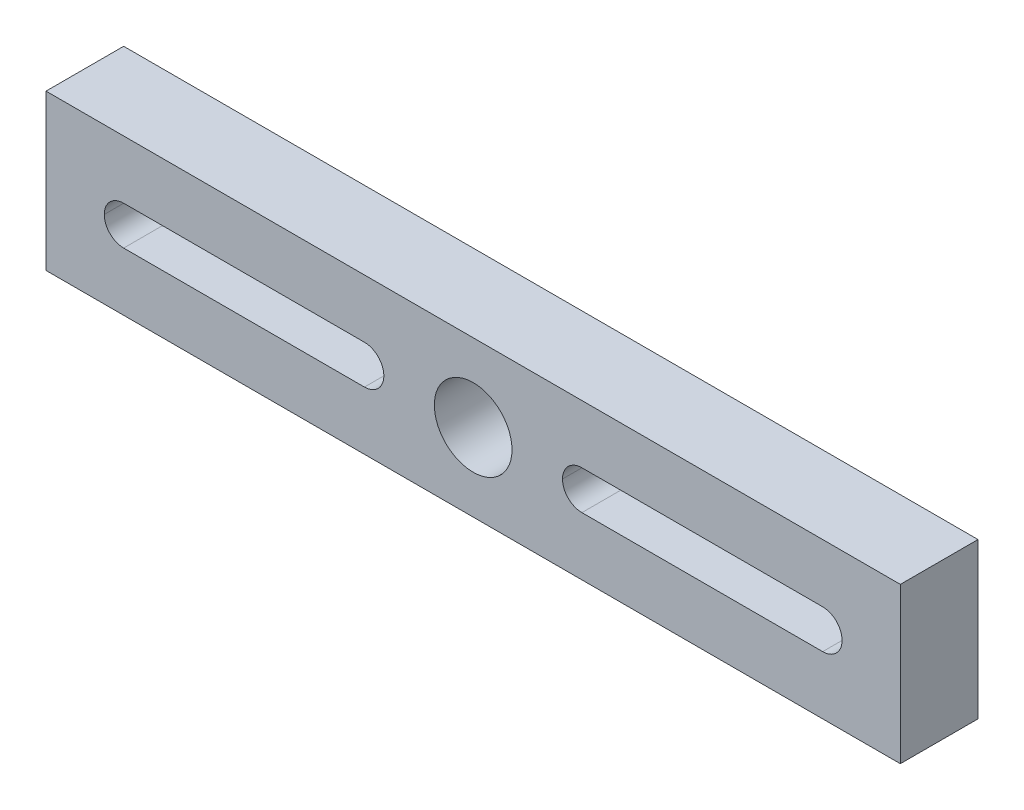
ISO-10303-21;
HEADER;
FILE_DESCRIPTION(('STEP AP214'),'2;1');
FILE_NAME('part.step','',(''),(''),'','','');
FILE_SCHEMA(('AUTOMOTIVE_DESIGN { 1 0 10303 214 1 1 1 1 }'));
ENDSEC;
DATA;
#1=APPLICATION_CONTEXT('core data for automotive mechanical design processes');
#2=APPLICATION_PROTOCOL_DEFINITION('international standard','automotive_design',2000,#1);
#3=PRODUCT_CONTEXT('',#1,'mechanical');
#4=PRODUCT('Part','Part','',(#3));
#5=PRODUCT_RELATED_PRODUCT_CATEGORY('part','',(#4));
#6=PRODUCT_DEFINITION_FORMATION('','',#4);
#7=PRODUCT_DEFINITION_CONTEXT('part definition',#1,'design');
#8=PRODUCT_DEFINITION('design','',#6,#7);
#9=PRODUCT_DEFINITION_SHAPE('','',#8);
#10=(LENGTH_UNIT() NAMED_UNIT(*) SI_UNIT(.MILLI.,.METRE.));
#11=(NAMED_UNIT(*) PLANE_ANGLE_UNIT() SI_UNIT($,.RADIAN.));
#12=(NAMED_UNIT(*) SI_UNIT($,.STERADIAN.) SOLID_ANGLE_UNIT());
#13=UNCERTAINTY_MEASURE_WITH_UNIT(LENGTH_MEASURE(1.E-05),#10,'distance_accuracy_value','');
#14=(GEOMETRIC_REPRESENTATION_CONTEXT(3) GLOBAL_UNCERTAINTY_ASSIGNED_CONTEXT((#13)) GLOBAL_UNIT_ASSIGNED_CONTEXT((#10,
#11,#12)) REPRESENTATION_CONTEXT('',''));
#15=CARTESIAN_POINT('',(0.,0.,0.));
#16=DIRECTION('',(0.,0.,1.));
#17=DIRECTION('',(1.,0.,0.));
#18=AXIS2_PLACEMENT_3D('',#15,#16,#17);
#19=CARTESIAN_POINT('',(0.,0.,12.7));
#20=DIRECTION('',(0.,0.,1.));
#21=DIRECTION('',(1.,0.,0.));
#22=AXIS2_PLACEMENT_3D('',#19,#20,#21);
#23=PLANE('',#22);
#24=CARTESIAN_POINT('',(-57.15,0.,12.7));
#25=DIRECTION('',(0.,0.,1.));
#26=DIRECTION('',(1.,0.,0.));
#27=AXIS2_PLACEMENT_3D('',#24,#25,#26);
#28=CIRCLE('',#27,3.175);
#29=CARTESIAN_POINT('',(-57.15,-3.175,12.7));
#30=VERTEX_POINT('',#29);
#31=CARTESIAN_POINT('',(-60.325,0.,12.7));
#32=VERTEX_POINT('',#31);
#33=EDGE_CURVE('E243',#30,#32,#28,.F.);
#34=ORIENTED_EDGE('',*,*,#33,.T.);
#35=CARTESIAN_POINT('',(-57.15,0.,12.7));
#36=DIRECTION('',(0.,0.,1.));
#37=DIRECTION('',(1.,0.,0.));
#38=AXIS2_PLACEMENT_3D('',#35,#36,#37);
#39=CIRCLE('',#38,3.175);
#40=CARTESIAN_POINT('',(-57.15,3.175,12.7));
#41=VERTEX_POINT('',#40);
#42=EDGE_CURVE('E249',#32,#41,#39,.F.);
#43=ORIENTED_EDGE('',*,*,#42,.T.);
#44=DIRECTION('',(-1.,0.,0.));
#45=VECTOR('',#44,1.);
#46=CARTESIAN_POINT('',(-60.325,3.175,12.7));
#47=LINE('',#46,#45);
#48=CARTESIAN_POINT('',(-17.78,3.175,12.7));
#49=VERTEX_POINT('',#48);
#50=EDGE_CURVE('E321',#49,#41,#47,.T.);
#51=ORIENTED_EDGE('',*,*,#50,.F.);
#52=CARTESIAN_POINT('',(-17.78,0.,12.7));
#53=DIRECTION('',(0.,0.,1.));
#54=DIRECTION('',(1.,0.,0.));
#55=AXIS2_PLACEMENT_3D('',#52,#53,#54);
#56=CIRCLE('',#55,3.175);
#57=CARTESIAN_POINT('',(-14.605,0.,12.7));
#58=VERTEX_POINT('',#57);
#59=EDGE_CURVE('E231',#49,#58,#56,.F.);
#60=ORIENTED_EDGE('',*,*,#59,.T.);
#61=CARTESIAN_POINT('',(-17.78,0.,12.7));
#62=DIRECTION('',(0.,0.,1.));
#63=DIRECTION('',(1.,0.,0.));
#64=AXIS2_PLACEMENT_3D('',#61,#62,#63);
#65=CIRCLE('',#64,3.175);
#66=CARTESIAN_POINT('',(-17.78,-3.175,12.7));
#67=VERTEX_POINT('',#66);
#68=EDGE_CURVE('E237',#58,#67,#65,.F.);
#69=ORIENTED_EDGE('',*,*,#68,.T.);
#70=DIRECTION('',(1.,0.,0.));
#71=VECTOR('',#70,1.);
#72=CARTESIAN_POINT('',(-60.325,-3.175,12.7));
#73=LINE('',#72,#71);
#74=EDGE_CURVE('E316',#30,#67,#73,.T.);
#75=ORIENTED_EDGE('',*,*,#74,.F.);
#76=EDGE_LOOP('',(#34,#43,#51,#60,#69,#75));
#77=FACE_BOUND('',#76,.T.);
#78=DIRECTION('',(-1.,0.,0.));
#79=VECTOR('',#78,1.);
#80=CARTESIAN_POINT('',(60.325,3.175,12.7));
#81=LINE('',#80,#79);
#82=CARTESIAN_POINT('',(57.15,3.175,12.7));
#83=VERTEX_POINT('',#82);
#84=CARTESIAN_POINT('',(17.78,3.175,12.7));
#85=VERTEX_POINT('',#84);
#86=EDGE_CURVE('E278',#83,#85,#81,.T.);
#87=ORIENTED_EDGE('',*,*,#86,.F.);
#88=CARTESIAN_POINT('',(57.15,0.,12.7));
#89=DIRECTION('',(0.,0.,1.));
#90=DIRECTION('',(1.,0.,0.));
#91=AXIS2_PLACEMENT_3D('',#88,#89,#90);
#92=CIRCLE('',#91,3.175);
#93=CARTESIAN_POINT('',(60.325,0.,12.7));
#94=VERTEX_POINT('',#93);
#95=EDGE_CURVE('E49',#83,#94,#92,.F.);
#96=ORIENTED_EDGE('',*,*,#95,.T.);
#97=CARTESIAN_POINT('',(57.15,0.,12.7));
#98=DIRECTION('',(0.,0.,1.));
#99=DIRECTION('',(1.,0.,0.));
#100=AXIS2_PLACEMENT_3D('',#97,#98,#99);
#101=CIRCLE('',#100,3.175);
#102=CARTESIAN_POINT('',(57.15,-3.175,12.7));
#103=VERTEX_POINT('',#102);
#104=EDGE_CURVE('E267',#94,#103,#101,.F.);
#105=ORIENTED_EDGE('',*,*,#104,.T.);
#106=DIRECTION('',(1.,0.,0.));
#107=VECTOR('',#106,1.);
#108=CARTESIAN_POINT('',(60.325,-3.175,12.7));
#109=LINE('',#108,#107);
#110=CARTESIAN_POINT('',(17.78,-3.175,12.7));
#111=VERTEX_POINT('',#110);
#112=EDGE_CURVE('E314',#111,#103,#109,.T.);
#113=ORIENTED_EDGE('',*,*,#112,.F.);
#114=CARTESIAN_POINT('',(17.78,0.,12.7));
#115=DIRECTION('',(0.,0.,1.));
#116=DIRECTION('',(1.,0.,0.));
#117=AXIS2_PLACEMENT_3D('',#114,#115,#116);
#118=CIRCLE('',#117,3.175);
#119=CARTESIAN_POINT('',(14.605,0.,12.7));
#120=VERTEX_POINT('',#119);
#121=EDGE_CURVE('E261',#111,#120,#118,.F.);
#122=ORIENTED_EDGE('',*,*,#121,.T.);
#123=CARTESIAN_POINT('',(17.78,0.,12.7));
#124=DIRECTION('',(0.,0.,1.));
#125=DIRECTION('',(1.,0.,0.));
#126=AXIS2_PLACEMENT_3D('',#123,#124,#125);
#127=CIRCLE('',#126,3.175);
#128=EDGE_CURVE('E255',#120,#85,#127,.F.);
#129=ORIENTED_EDGE('',*,*,#128,.T.);
#130=EDGE_LOOP('',(#87,#96,#105,#113,#122,#129));
#131=FACE_BOUND('',#130,.T.);
#132=DIRECTION('',(0.,-1.,0.));
#133=VECTOR('',#132,1.);
#134=CARTESIAN_POINT('',(-69.85,12.7,12.7));
#135=LINE('',#134,#133);
#136=CARTESIAN_POINT('',(-69.85,12.7,12.7));
#137=VERTEX_POINT('',#136);
#138=CARTESIAN_POINT('',(-69.85,-12.7,12.7));
#139=VERTEX_POINT('',#138);
#140=EDGE_CURVE('E166',#137,#139,#135,.T.);
#141=ORIENTED_EDGE('',*,*,#140,.T.);
#142=DIRECTION('',(1.,0.,0.));
#143=VECTOR('',#142,1.);
#144=CARTESIAN_POINT('',(-69.85,-12.7,12.7));
#145=LINE('',#144,#143);
#146=CARTESIAN_POINT('',(69.85,-12.7,12.7));
#147=VERTEX_POINT('',#146);
#148=EDGE_CURVE('E154',#139,#147,#145,.T.);
#149=ORIENTED_EDGE('',*,*,#148,.T.);
#150=DIRECTION('',(0.,1.,0.));
#151=VECTOR('',#150,1.);
#152=CARTESIAN_POINT('',(69.85,12.7,12.7));
#153=LINE('',#152,#151);
#154=CARTESIAN_POINT('',(69.85,12.7,12.7));
#155=VERTEX_POINT('',#154);
#156=EDGE_CURVE('E165',#147,#155,#153,.T.);
#157=ORIENTED_EDGE('',*,*,#156,.T.);
#158=DIRECTION('',(-1.,0.,0.));
#159=VECTOR('',#158,1.);
#160=CARTESIAN_POINT('',(-69.85,12.7,12.7));
#161=LINE('',#160,#159);
#162=EDGE_CURVE('E171',#155,#137,#161,.T.);
#163=ORIENTED_EDGE('',*,*,#162,.T.);
#164=EDGE_LOOP('',(#141,#149,#157,#163));
#165=FACE_BOUND('',#164,.T.);
#166=CARTESIAN_POINT('',(0.,0.,12.7));
#167=DIRECTION('',(0.,0.,1.));
#168=DIRECTION('',(1.,0.,0.));
#169=AXIS2_PLACEMENT_3D('',#166,#167,#168);
#170=CIRCLE('',#169,6.35);
#171=CARTESIAN_POINT('',(6.35,0.,12.7));
#172=VERTEX_POINT('',#171);
#173=EDGE_CURVE('E326',#172,#172,#170,.T.);
#174=ORIENTED_EDGE('',*,*,#173,.F.);
#175=EDGE_LOOP('',(#174));
#176=FACE_BOUND('',#175,.T.);
#177=ADVANCED_FACE('F39',(#77,#131,#165,#176),#23,.T.);
#178=CARTESIAN_POINT('',(0.,0.,0.));
#179=DIRECTION('',(0.,0.,1.));
#180=DIRECTION('',(1.,0.,0.));
#181=AXIS2_PLACEMENT_3D('',#178,#179,#180);
#182=PLANE('',#181);
#183=DIRECTION('',(1.,0.,0.));
#184=VECTOR('',#183,1.);
#185=CARTESIAN_POINT('',(0.,-3.175,0.));
#186=LINE('',#185,#184);
#187=CARTESIAN_POINT('',(-57.15,-3.175,0.));
#188=VERTEX_POINT('',#187);
#189=CARTESIAN_POINT('',(-17.78,-3.175,0.));
#190=VERTEX_POINT('',#189);
#191=EDGE_CURVE('E195',#188,#190,#186,.T.);
#192=ORIENTED_EDGE('',*,*,#191,.T.);
#193=CARTESIAN_POINT('',(-17.78,0.,0.));
#194=DIRECTION('',(0.,0.,1.));
#195=DIRECTION('',(1.,0.,0.));
#196=AXIS2_PLACEMENT_3D('',#193,#194,#195);
#197=CIRCLE('',#196,3.175);
#198=CARTESIAN_POINT('',(-14.605,0.,0.));
#199=VERTEX_POINT('',#198);
#200=EDGE_CURVE('E240',#190,#199,#197,.T.);
#201=ORIENTED_EDGE('',*,*,#200,.T.);
#202=CARTESIAN_POINT('',(-17.78,0.,0.));
#203=DIRECTION('',(0.,0.,1.));
#204=DIRECTION('',(1.,0.,0.));
#205=AXIS2_PLACEMENT_3D('',#202,#203,#204);
#206=CIRCLE('',#205,3.175);
#207=CARTESIAN_POINT('',(-17.78,3.175,0.));
#208=VERTEX_POINT('',#207);
#209=EDGE_CURVE('E234',#199,#208,#206,.T.);
#210=ORIENTED_EDGE('',*,*,#209,.T.);
#211=DIRECTION('',(-1.,0.,0.));
#212=VECTOR('',#211,1.);
#213=CARTESIAN_POINT('',(0.,3.175,0.));
#214=LINE('',#213,#212);
#215=CARTESIAN_POINT('',(-57.15,3.175,0.));
#216=VERTEX_POINT('',#215);
#217=EDGE_CURVE('E199',#208,#216,#214,.T.);
#218=ORIENTED_EDGE('',*,*,#217,.T.);
#219=CARTESIAN_POINT('',(-57.15,0.,0.));
#220=DIRECTION('',(0.,0.,1.));
#221=DIRECTION('',(1.,0.,0.));
#222=AXIS2_PLACEMENT_3D('',#219,#220,#221);
#223=CIRCLE('',#222,3.175);
#224=CARTESIAN_POINT('',(-60.325,0.,0.));
#225=VERTEX_POINT('',#224);
#226=EDGE_CURVE('E252',#216,#225,#223,.T.);
#227=ORIENTED_EDGE('',*,*,#226,.T.);
#228=CARTESIAN_POINT('',(-57.15,0.,0.));
#229=DIRECTION('',(0.,0.,1.));
#230=DIRECTION('',(1.,0.,0.));
#231=AXIS2_PLACEMENT_3D('',#228,#229,#230);
#232=CIRCLE('',#231,3.175);
#233=EDGE_CURVE('E246',#225,#188,#232,.T.);
#234=ORIENTED_EDGE('',*,*,#233,.T.);
#235=EDGE_LOOP('',(#192,#201,#210,#218,#227,#234));
#236=FACE_BOUND('',#235,.T.);
#237=CARTESIAN_POINT('',(57.15,0.,0.));
#238=DIRECTION('',(0.,0.,1.));
#239=DIRECTION('',(1.,0.,0.));
#240=AXIS2_PLACEMENT_3D('',#237,#238,#239);
#241=CIRCLE('',#240,3.175);
#242=CARTESIAN_POINT('',(57.15,-3.175,0.));
#243=VERTEX_POINT('',#242);
#244=CARTESIAN_POINT('',(60.325,0.,0.));
#245=VERTEX_POINT('',#244);
#246=EDGE_CURVE('E56',#243,#245,#241,.T.);
#247=ORIENTED_EDGE('',*,*,#246,.T.);
#248=CARTESIAN_POINT('',(57.15,0.,0.));
#249=DIRECTION('',(0.,0.,1.));
#250=DIRECTION('',(1.,0.,0.));
#251=AXIS2_PLACEMENT_3D('',#248,#249,#250);
#252=CIRCLE('',#251,3.175);
#253=CARTESIAN_POINT('',(57.15,3.175,0.));
#254=VERTEX_POINT('',#253);
#255=EDGE_CURVE('E11',#245,#254,#252,.T.);
#256=ORIENTED_EDGE('',*,*,#255,.T.);
#257=DIRECTION('',(-1.,0.,0.));
#258=VECTOR('',#257,1.);
#259=CARTESIAN_POINT('',(0.,3.175,0.));
#260=LINE('',#259,#258);
#261=CARTESIAN_POINT('',(17.78,3.175,0.));
#262=VERTEX_POINT('',#261);
#263=EDGE_CURVE('E186',#254,#262,#260,.T.);
#264=ORIENTED_EDGE('',*,*,#263,.T.);
#265=CARTESIAN_POINT('',(17.78,0.,0.));
#266=DIRECTION('',(0.,0.,1.));
#267=DIRECTION('',(1.,0.,0.));
#268=AXIS2_PLACEMENT_3D('',#265,#266,#267);
#269=CIRCLE('',#268,3.175);
#270=CARTESIAN_POINT('',(14.605,0.,0.));
#271=VERTEX_POINT('',#270);
#272=EDGE_CURVE('E258',#262,#271,#269,.T.);
#273=ORIENTED_EDGE('',*,*,#272,.T.);
#274=CARTESIAN_POINT('',(17.78,0.,0.));
#275=DIRECTION('',(0.,0.,1.));
#276=DIRECTION('',(1.,0.,0.));
#277=AXIS2_PLACEMENT_3D('',#274,#275,#276);
#278=CIRCLE('',#277,3.175);
#279=CARTESIAN_POINT('',(17.78,-3.175,0.));
#280=VERTEX_POINT('',#279);
#281=EDGE_CURVE('E264',#271,#280,#278,.T.);
#282=ORIENTED_EDGE('',*,*,#281,.T.);
#283=DIRECTION('',(1.,0.,0.));
#284=VECTOR('',#283,1.);
#285=CARTESIAN_POINT('',(0.,-3.175,0.));
#286=LINE('',#285,#284);
#287=EDGE_CURVE('E182',#280,#243,#286,.T.);
#288=ORIENTED_EDGE('',*,*,#287,.T.);
#289=EDGE_LOOP('',(#247,#256,#264,#273,#282,#288));
#290=FACE_BOUND('',#289,.T.);
#291=DIRECTION('',(0.,-1.,0.));
#292=VECTOR('',#291,1.);
#293=CARTESIAN_POINT('',(-69.85,12.7,0.));
#294=LINE('',#293,#292);
#295=CARTESIAN_POINT('',(-69.85,12.7,0.));
#296=VERTEX_POINT('',#295);
#297=CARTESIAN_POINT('',(-69.85,-12.7,0.));
#298=VERTEX_POINT('',#297);
#299=EDGE_CURVE('E180',#296,#298,#294,.T.);
#300=ORIENTED_EDGE('',*,*,#299,.F.);
#301=DIRECTION('',(-1.,0.,0.));
#302=VECTOR('',#301,1.);
#303=CARTESIAN_POINT('',(-69.85,12.7,0.));
#304=LINE('',#303,#302);
#305=CARTESIAN_POINT('',(69.85,12.7,0.));
#306=VERTEX_POINT('',#305);
#307=EDGE_CURVE('E176',#306,#296,#304,.T.);
#308=ORIENTED_EDGE('',*,*,#307,.F.);
#309=DIRECTION('',(0.,1.,0.));
#310=VECTOR('',#309,1.);
#311=CARTESIAN_POINT('',(69.85,12.7,0.));
#312=LINE('',#311,#310);
#313=CARTESIAN_POINT('',(69.85,-12.7,0.));
#314=VERTEX_POINT('',#313);
#315=EDGE_CURVE('E344',#314,#306,#312,.T.);
#316=ORIENTED_EDGE('',*,*,#315,.F.);
#317=DIRECTION('',(1.,0.,0.));
#318=VECTOR('',#317,1.);
#319=CARTESIAN_POINT('',(-69.85,-12.7,0.));
#320=LINE('',#319,#318);
#321=EDGE_CURVE('E341',#298,#314,#320,.T.);
#322=ORIENTED_EDGE('',*,*,#321,.F.);
#323=EDGE_LOOP('',(#300,#308,#316,#322));
#324=FACE_BOUND('',#323,.T.);
#325=CARTESIAN_POINT('',(0.,0.,0.));
#326=DIRECTION('',(0.,0.,1.));
#327=DIRECTION('',(1.,0.,0.));
#328=AXIS2_PLACEMENT_3D('',#325,#326,#327);
#329=CIRCLE('',#328,6.35);
#330=CARTESIAN_POINT('',(6.35,0.,0.));
#331=VERTEX_POINT('',#330);
#332=EDGE_CURVE('E330',#331,#331,#329,.T.);
#333=ORIENTED_EDGE('',*,*,#332,.T.);
#334=EDGE_LOOP('',(#333));
#335=FACE_BOUND('',#334,.T.);
#336=ADVANCED_FACE('F297',(#236,#290,#324,#335),#182,.F.);
#337=CARTESIAN_POINT('',(-69.85,12.7,12.7));
#338=DIRECTION('',(1.,0.,0.));
#339=DIRECTION('',(0.,0.,-1.));
#340=AXIS2_PLACEMENT_3D('',#337,#338,#339);
#341=PLANE('',#340);
#342=ORIENTED_EDGE('',*,*,#299,.T.);
#343=DIRECTION('',(0.,0.,-1.));
#344=VECTOR('',#343,1.);
#345=CARTESIAN_POINT('',(-69.85,-12.7,12.7));
#346=LINE('',#345,#344);
#347=EDGE_CURVE('E158',#139,#298,#346,.T.);
#348=ORIENTED_EDGE('',*,*,#347,.F.);
#349=ORIENTED_EDGE('',*,*,#140,.F.);
#350=DIRECTION('',(0.,0.,-1.));
#351=VECTOR('',#350,1.);
#352=CARTESIAN_POINT('',(-69.85,12.7,12.7));
#353=LINE('',#352,#351);
#354=EDGE_CURVE('E338',#137,#296,#353,.T.);
#355=ORIENTED_EDGE('',*,*,#354,.T.);
#356=EDGE_LOOP('',(#342,#348,#349,#355));
#357=FACE_BOUND('',#356,.T.);
#358=ADVANCED_FACE('F178',(#357),#341,.F.);
#359=CARTESIAN_POINT('',(-69.85,-12.7,12.7));
#360=DIRECTION('',(0.,1.,0.));
#361=DIRECTION('',(0.,0.,1.));
#362=AXIS2_PLACEMENT_3D('',#359,#360,#361);
#363=PLANE('',#362);
#364=ORIENTED_EDGE('',*,*,#321,.T.);
#365=DIRECTION('',(0.,0.,-1.));
#366=VECTOR('',#365,1.);
#367=CARTESIAN_POINT('',(69.85,-12.7,12.7));
#368=LINE('',#367,#366);
#369=EDGE_CURVE('E161',#147,#314,#368,.T.);
#370=ORIENTED_EDGE('',*,*,#369,.F.);
#371=ORIENTED_EDGE('',*,*,#148,.F.);
#372=ORIENTED_EDGE('',*,*,#347,.T.);
#373=EDGE_LOOP('',(#364,#370,#371,#372));
#374=FACE_BOUND('',#373,.T.);
#375=ADVANCED_FACE('F156',(#374),#363,.F.);
#376=CARTESIAN_POINT('',(69.85,12.7,12.7));
#377=DIRECTION('',(-1.,0.,0.));
#378=DIRECTION('',(0.,0.,1.));
#379=AXIS2_PLACEMENT_3D('',#376,#377,#378);
#380=PLANE('',#379);
#381=ORIENTED_EDGE('',*,*,#315,.T.);
#382=DIRECTION('',(0.,0.,-1.));
#383=VECTOR('',#382,1.);
#384=CARTESIAN_POINT('',(69.85,12.7,12.7));
#385=LINE('',#384,#383);
#386=EDGE_CURVE('E188',#155,#306,#385,.T.);
#387=ORIENTED_EDGE('',*,*,#386,.F.);
#388=ORIENTED_EDGE('',*,*,#156,.F.);
#389=ORIENTED_EDGE('',*,*,#369,.T.);
#390=EDGE_LOOP('',(#381,#387,#388,#389));
#391=FACE_BOUND('',#390,.T.);
#392=ADVANCED_FACE('F359',(#391),#380,.F.);
#393=CARTESIAN_POINT('',(-69.85,12.7,12.7));
#394=DIRECTION('',(0.,-1.,0.));
#395=DIRECTION('',(0.,0.,-1.));
#396=AXIS2_PLACEMENT_3D('',#393,#394,#395);
#397=PLANE('',#396);
#398=ORIENTED_EDGE('',*,*,#307,.T.);
#399=ORIENTED_EDGE('',*,*,#354,.F.);
#400=ORIENTED_EDGE('',*,*,#162,.F.);
#401=ORIENTED_EDGE('',*,*,#386,.T.);
#402=EDGE_LOOP('',(#398,#399,#400,#401));
#403=FACE_BOUND('',#402,.T.);
#404=ADVANCED_FACE('F355',(#403),#397,.F.);
#405=CARTESIAN_POINT('',(0.,0.,12.7));
#406=DIRECTION('',(0.,0.,-1.));
#407=DIRECTION('',(-1.,0.,0.));
#408=AXIS2_PLACEMENT_3D('',#405,#406,#407);
#409=CYLINDRICAL_SURFACE('',#408,6.35);
#410=ORIENTED_EDGE('',*,*,#173,.T.);
#411=EDGE_LOOP('',(#410));
#412=FACE_BOUND('',#411,.T.);
#413=ORIENTED_EDGE('',*,*,#332,.F.);
#414=EDGE_LOOP('',(#413));
#415=FACE_BOUND('',#414,.T.);
#416=ADVANCED_FACE('F366',(#412,#415),#409,.F.);
#417=CARTESIAN_POINT('',(60.325,3.175,-0.635000000000002));
#418=DIRECTION('',(0.,1.,0.));
#419=DIRECTION('',(0.,0.,1.));
#420=AXIS2_PLACEMENT_3D('',#417,#418,#419);
#421=PLANE('',#420);
#422=ORIENTED_EDGE('',*,*,#86,.T.);
#423=DIRECTION('',(0.,0.,1.));
#424=VECTOR('',#423,1.);
#425=CARTESIAN_POINT('',(17.78,3.175,0.));
#426=LINE('',#425,#424);
#427=EDGE_CURVE('E220',#85,#262,#426,.F.);
#428=ORIENTED_EDGE('',*,*,#427,.T.);
#429=ORIENTED_EDGE('',*,*,#263,.F.);
#430=DIRECTION('',(0.,0.,1.));
#431=VECTOR('',#430,1.);
#432=CARTESIAN_POINT('',(57.15,3.175,12.7));
#433=LINE('',#432,#431);
#434=EDGE_CURVE('E217',#254,#83,#433,.T.);
#435=ORIENTED_EDGE('',*,*,#434,.T.);
#436=EDGE_LOOP('',(#422,#428,#429,#435));
#437=FACE_BOUND('',#436,.T.);
#438=ADVANCED_FACE('F301',(#437),#421,.F.);
#439=CARTESIAN_POINT('',(60.325,-3.175,-0.635000000000002));
#440=DIRECTION('',(0.,-1.,0.));
#441=DIRECTION('',(0.,0.,-1.));
#442=AXIS2_PLACEMENT_3D('',#439,#440,#441);
#443=PLANE('',#442);
#444=ORIENTED_EDGE('',*,*,#287,.F.);
#445=DIRECTION('',(0.,0.,1.));
#446=VECTOR('',#445,1.);
#447=CARTESIAN_POINT('',(17.78,-3.175,12.7));
#448=LINE('',#447,#446);
#449=EDGE_CURVE('E228',#280,#111,#448,.T.);
#450=ORIENTED_EDGE('',*,*,#449,.T.);
#451=ORIENTED_EDGE('',*,*,#112,.T.);
#452=DIRECTION('',(0.,0.,1.));
#453=VECTOR('',#452,1.);
#454=CARTESIAN_POINT('',(57.15,-3.175,0.));
#455=LINE('',#454,#453);
#456=EDGE_CURVE('E224',#103,#243,#455,.F.);
#457=ORIENTED_EDGE('',*,*,#456,.T.);
#458=EDGE_LOOP('',(#444,#450,#451,#457));
#459=FACE_BOUND('',#458,.T.);
#460=ADVANCED_FACE('F313',(#459),#443,.F.);
#461=CARTESIAN_POINT('',(-60.325,3.175,-0.635000000000002));
#462=DIRECTION('',(0.,1.,0.));
#463=DIRECTION('',(0.,0.,1.));
#464=AXIS2_PLACEMENT_3D('',#461,#462,#463);
#465=PLANE('',#464);
#466=ORIENTED_EDGE('',*,*,#217,.F.);
#467=DIRECTION('',(0.,0.,1.));
#468=VECTOR('',#467,1.);
#469=CARTESIAN_POINT('',(-17.78,3.175,12.7));
#470=LINE('',#469,#468);
#471=EDGE_CURVE('E206',#208,#49,#470,.T.);
#472=ORIENTED_EDGE('',*,*,#471,.T.);
#473=ORIENTED_EDGE('',*,*,#50,.T.);
#474=DIRECTION('',(0.,0.,1.));
#475=VECTOR('',#474,1.);
#476=CARTESIAN_POINT('',(-57.15,3.175,0.));
#477=LINE('',#476,#475);
#478=EDGE_CURVE('E203',#41,#216,#477,.F.);
#479=ORIENTED_EDGE('',*,*,#478,.T.);
#480=EDGE_LOOP('',(#466,#472,#473,#479));
#481=FACE_BOUND('',#480,.T.);
#482=ADVANCED_FACE('F385',(#481),#465,.F.);
#483=CARTESIAN_POINT('',(-60.325,-3.175,-0.635000000000002));
#484=DIRECTION('',(0.,-1.,0.));
#485=DIRECTION('',(0.,0.,-1.));
#486=AXIS2_PLACEMENT_3D('',#483,#484,#485);
#487=PLANE('',#486);
#488=ORIENTED_EDGE('',*,*,#74,.T.);
#489=DIRECTION('',(0.,0.,1.));
#490=VECTOR('',#489,1.);
#491=CARTESIAN_POINT('',(-17.78,-3.175,0.));
#492=LINE('',#491,#490);
#493=EDGE_CURVE('E214',#67,#190,#492,.F.);
#494=ORIENTED_EDGE('',*,*,#493,.T.);
#495=ORIENTED_EDGE('',*,*,#191,.F.);
#496=DIRECTION('',(0.,0.,1.));
#497=VECTOR('',#496,1.);
#498=CARTESIAN_POINT('',(-57.15,-3.175,12.7));
#499=LINE('',#498,#497);
#500=EDGE_CURVE('E210',#188,#30,#499,.T.);
#501=ORIENTED_EDGE('',*,*,#500,.T.);
#502=EDGE_LOOP('',(#488,#494,#495,#501));
#503=FACE_BOUND('',#502,.T.);
#504=ADVANCED_FACE('F386',(#503),#487,.F.);
#505=CARTESIAN_POINT('',(-17.78,0.,-0.635000000000002));
#506=DIRECTION('',(0.,0.,-1.));
#507=DIRECTION('',(-1.,0.,0.));
#508=AXIS2_PLACEMENT_3D('',#505,#506,#507);
#509=CYLINDRICAL_SURFACE('',#508,3.175);
#510=DIRECTION('',(0.,0.,1.));
#511=VECTOR('',#510,1.);
#512=CARTESIAN_POINT('',(-14.605,0.,12.7));
#513=LINE('',#512,#511);
#514=EDGE_CURVE('E274',#199,#58,#513,.T.);
#515=ORIENTED_EDGE('',*,*,#514,.F.);
#516=ORIENTED_EDGE('',*,*,#200,.F.);
#517=ORIENTED_EDGE('',*,*,#493,.F.);
#518=ORIENTED_EDGE('',*,*,#68,.F.);
#519=EDGE_LOOP('',(#515,#516,#517,#518));
#520=FACE_BOUND('',#519,.T.);
#521=ADVANCED_FACE('F389',(#520),#509,.F.);
#522=CARTESIAN_POINT('',(-17.78,0.,-0.635000000000002));
#523=DIRECTION('',(0.,0.,-1.));
#524=DIRECTION('',(-1.,0.,0.));
#525=AXIS2_PLACEMENT_3D('',#522,#523,#524);
#526=CYLINDRICAL_SURFACE('',#525,3.175);
#527=ORIENTED_EDGE('',*,*,#209,.F.);
#528=ORIENTED_EDGE('',*,*,#514,.T.);
#529=ORIENTED_EDGE('',*,*,#59,.F.);
#530=ORIENTED_EDGE('',*,*,#471,.F.);
#531=EDGE_LOOP('',(#527,#528,#529,#530));
#532=FACE_BOUND('',#531,.T.);
#533=ADVANCED_FACE('F403',(#532),#526,.F.);
#534=CARTESIAN_POINT('',(-57.15,0.,-0.635000000000002));
#535=DIRECTION('',(0.,0.,-1.));
#536=DIRECTION('',(-1.,0.,0.));
#537=AXIS2_PLACEMENT_3D('',#534,#535,#536);
#538=CYLINDRICAL_SURFACE('',#537,3.175);
#539=DIRECTION('',(0.,0.,1.));
#540=VECTOR('',#539,1.);
#541=CARTESIAN_POINT('',(-60.325,0.,12.7));
#542=LINE('',#541,#540);
#543=EDGE_CURVE('E279',#225,#32,#542,.T.);
#544=ORIENTED_EDGE('',*,*,#543,.F.);
#545=ORIENTED_EDGE('',*,*,#226,.F.);
#546=ORIENTED_EDGE('',*,*,#478,.F.);
#547=ORIENTED_EDGE('',*,*,#42,.F.);
#548=EDGE_LOOP('',(#544,#545,#546,#547));
#549=FACE_BOUND('',#548,.T.);
#550=ADVANCED_FACE('F418',(#549),#538,.F.);
#551=CARTESIAN_POINT('',(-57.15,0.,-0.635000000000002));
#552=DIRECTION('',(0.,0.,-1.));
#553=DIRECTION('',(-1.,0.,0.));
#554=AXIS2_PLACEMENT_3D('',#551,#552,#553);
#555=CYLINDRICAL_SURFACE('',#554,3.175);
#556=ORIENTED_EDGE('',*,*,#233,.F.);
#557=ORIENTED_EDGE('',*,*,#543,.T.);
#558=ORIENTED_EDGE('',*,*,#33,.F.);
#559=ORIENTED_EDGE('',*,*,#500,.F.);
#560=EDGE_LOOP('',(#556,#557,#558,#559));
#561=FACE_BOUND('',#560,.T.);
#562=ADVANCED_FACE('F415',(#561),#555,.F.);
#563=CARTESIAN_POINT('',(17.78,0.,-0.635000000000002));
#564=DIRECTION('',(0.,0.,-1.));
#565=DIRECTION('',(-1.,0.,0.));
#566=AXIS2_PLACEMENT_3D('',#563,#564,#565);
#567=CYLINDRICAL_SURFACE('',#566,3.175);
#568=ORIENTED_EDGE('',*,*,#449,.F.);
#569=ORIENTED_EDGE('',*,*,#281,.F.);
#570=DIRECTION('',(0.,0.,1.));
#571=VECTOR('',#570,1.);
#572=CARTESIAN_POINT('',(14.605,0.,0.));
#573=LINE('',#572,#571);
#574=EDGE_CURVE('E282',#120,#271,#573,.F.);
#575=ORIENTED_EDGE('',*,*,#574,.F.);
#576=ORIENTED_EDGE('',*,*,#121,.F.);
#577=EDGE_LOOP('',(#568,#569,#575,#576));
#578=FACE_BOUND('',#577,.T.);
#579=ADVANCED_FACE('F308',(#578),#567,.F.);
#580=CARTESIAN_POINT('',(17.78,0.,-0.635000000000002));
#581=DIRECTION('',(0.,0.,-1.));
#582=DIRECTION('',(-1.,0.,0.));
#583=AXIS2_PLACEMENT_3D('',#580,#581,#582);
#584=CYLINDRICAL_SURFACE('',#583,3.175);
#585=ORIENTED_EDGE('',*,*,#272,.F.);
#586=ORIENTED_EDGE('',*,*,#427,.F.);
#587=ORIENTED_EDGE('',*,*,#128,.F.);
#588=ORIENTED_EDGE('',*,*,#574,.T.);
#589=EDGE_LOOP('',(#585,#586,#587,#588));
#590=FACE_BOUND('',#589,.T.);
#591=ADVANCED_FACE('F303',(#590),#584,.F.);
#592=CARTESIAN_POINT('',(57.15,0.,-0.635000000000002));
#593=DIRECTION('',(0.,0.,-1.));
#594=DIRECTION('',(-1.,0.,0.));
#595=AXIS2_PLACEMENT_3D('',#592,#593,#594);
#596=CYLINDRICAL_SURFACE('',#595,3.175);
#597=ORIENTED_EDGE('',*,*,#434,.F.);
#598=ORIENTED_EDGE('',*,*,#255,.F.);
#599=DIRECTION('',(0.,0.,1.));
#600=VECTOR('',#599,1.);
#601=CARTESIAN_POINT('',(60.325,0.,0.));
#602=LINE('',#601,#600);
#603=EDGE_CURVE('E43',#94,#245,#602,.F.);
#604=ORIENTED_EDGE('',*,*,#603,.F.);
#605=ORIENTED_EDGE('',*,*,#95,.F.);
#606=EDGE_LOOP('',(#597,#598,#604,#605));
#607=FACE_BOUND('',#606,.T.);
#608=ADVANCED_FACE('F41',(#607),#596,.F.);
#609=CARTESIAN_POINT('',(57.15,0.,-0.635000000000002));
#610=DIRECTION('',(0.,0.,-1.));
#611=DIRECTION('',(-1.,0.,0.));
#612=AXIS2_PLACEMENT_3D('',#609,#610,#611);
#613=CYLINDRICAL_SURFACE('',#612,3.175);
#614=ORIENTED_EDGE('',*,*,#246,.F.);
#615=ORIENTED_EDGE('',*,*,#456,.F.);
#616=ORIENTED_EDGE('',*,*,#104,.F.);
#617=ORIENTED_EDGE('',*,*,#603,.T.);
#618=EDGE_LOOP('',(#614,#615,#616,#617));
#619=FACE_BOUND('',#618,.T.);
#620=ADVANCED_FACE('F292',(#619),#613,.F.);
#621=CLOSED_SHELL('',(#177,#336,#358,#375,#392,#404,#416,#438,#460,#482,#504,#521,#533,#550,
#562,#579,#591,#608,#620));
#622=MANIFOLD_SOLID_BREP('B2',#621);
#623=ADVANCED_BREP_SHAPE_REPRESENTATION('',(#18,#622),#14);
#624=SHAPE_DEFINITION_REPRESENTATION(#9,#623);
ENDSEC;
END-ISO-10303-21;
